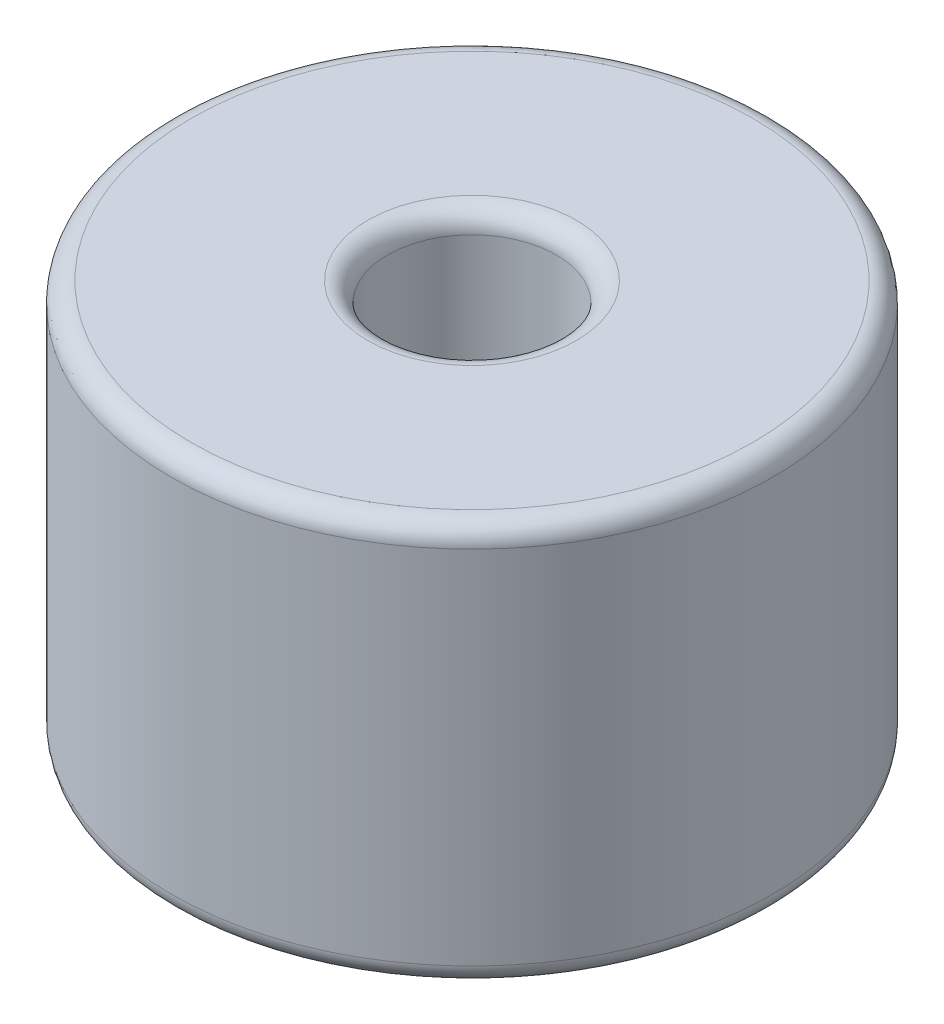
ISO-10303-21;
HEADER;
FILE_DESCRIPTION(('STEP AP214'),'2;1');
FILE_NAME('part.step','',(''),(''),'','','');
FILE_SCHEMA(('AUTOMOTIVE_DESIGN { 1 0 10303 214 1 1 1 1 }'));
ENDSEC;
DATA;
#1=APPLICATION_CONTEXT('core data for automotive mechanical design processes');
#2=APPLICATION_PROTOCOL_DEFINITION('international standard','automotive_design',2000,#1);
#3=PRODUCT_CONTEXT('',#1,'mechanical');
#4=PRODUCT('Part','Part','',(#3));
#5=PRODUCT_RELATED_PRODUCT_CATEGORY('part','',(#4));
#6=PRODUCT_DEFINITION_FORMATION('','',#4);
#7=PRODUCT_DEFINITION_CONTEXT('part definition',#1,'design');
#8=PRODUCT_DEFINITION('design','',#6,#7);
#9=PRODUCT_DEFINITION_SHAPE('','',#8);
#10=(LENGTH_UNIT() NAMED_UNIT(*) SI_UNIT(.MILLI.,.METRE.));
#11=(NAMED_UNIT(*) PLANE_ANGLE_UNIT() SI_UNIT($,.RADIAN.));
#12=(NAMED_UNIT(*) SI_UNIT($,.STERADIAN.) SOLID_ANGLE_UNIT());
#13=UNCERTAINTY_MEASURE_WITH_UNIT(LENGTH_MEASURE(1.E-05),#10,'distance_accuracy_value','');
#14=(GEOMETRIC_REPRESENTATION_CONTEXT(3) GLOBAL_UNCERTAINTY_ASSIGNED_CONTEXT((#13)) GLOBAL_UNIT_ASSIGNED_CONTEXT((#10,
#11,#12)) REPRESENTATION_CONTEXT('',''));
#15=CARTESIAN_POINT('',(0.,0.,0.));
#16=DIRECTION('',(0.,0.,1.));
#17=DIRECTION('',(1.,0.,0.));
#18=AXIS2_PLACEMENT_3D('',#15,#16,#17);
#19=CARTESIAN_POINT('',(0.,10.,0.));
#20=DIRECTION('',(0.,1.,0.));
#21=DIRECTION('',(0.,0.,1.));
#22=AXIS2_PLACEMENT_3D('',#19,#20,#21);
#23=PLANE('',#22);
#24=CARTESIAN_POINT('',(0.,10.,0.));
#25=DIRECTION('',(0.,1.,0.));
#26=DIRECTION('',(0.,0.,1.));
#27=AXIS2_PLACEMENT_3D('',#24,#25,#26);
#28=CIRCLE('',#27,7.);
#29=CARTESIAN_POINT('',(0.,10.,7.));
#30=VERTEX_POINT('',#29);
#31=EDGE_CURVE('E42',#30,#30,#28,.T.);
#32=ORIENTED_EDGE('',*,*,#31,.T.);
#33=EDGE_LOOP('',(#32));
#34=FACE_BOUND('',#33,.T.);
#35=CARTESIAN_POINT('',(0.,10.,0.));
#36=DIRECTION('',(0.,1.,0.));
#37=DIRECTION('',(0.,0.,1.));
#38=AXIS2_PLACEMENT_3D('',#35,#36,#37);
#39=CIRCLE('',#38,2.6);
#40=CARTESIAN_POINT('',(0.,10.,2.6));
#41=VERTEX_POINT('',#40);
#42=EDGE_CURVE('E46',#41,#41,#39,.F.);
#43=ORIENTED_EDGE('',*,*,#42,.T.);
#44=EDGE_LOOP('',(#43));
#45=FACE_BOUND('',#44,.T.);
#46=ADVANCED_FACE('F31',(#34,#45),#23,.T.);
#47=CARTESIAN_POINT('',(0.,0.,0.));
#48=DIRECTION('',(0.,1.,0.));
#49=DIRECTION('',(0.,0.,1.));
#50=AXIS2_PLACEMENT_3D('',#47,#48,#49);
#51=PLANE('',#50);
#52=CARTESIAN_POINT('',(0.,0.,0.));
#53=DIRECTION('',(0.,1.,0.));
#54=DIRECTION('',(0.,0.,1.));
#55=AXIS2_PLACEMENT_3D('',#52,#53,#54);
#56=CIRCLE('',#55,7.);
#57=CARTESIAN_POINT('',(0.,0.,7.));
#58=VERTEX_POINT('',#57);
#59=EDGE_CURVE('E51',#58,#58,#56,.F.);
#60=ORIENTED_EDGE('',*,*,#59,.T.);
#61=EDGE_LOOP('',(#60));
#62=FACE_BOUND('',#61,.T.);
#63=CARTESIAN_POINT('',(0.,0.,0.));
#64=DIRECTION('',(0.,1.,0.));
#65=DIRECTION('',(0.,0.,1.));
#66=AXIS2_PLACEMENT_3D('',#63,#64,#65);
#67=CIRCLE('',#66,2.6);
#68=CARTESIAN_POINT('',(0.,0.,2.6));
#69=VERTEX_POINT('',#68);
#70=EDGE_CURVE('E54',#69,#69,#67,.T.);
#71=ORIENTED_EDGE('',*,*,#70,.T.);
#72=EDGE_LOOP('',(#71));
#73=FACE_BOUND('',#72,.T.);
#74=ADVANCED_FACE('F76',(#62,#73),#51,.F.);
#75=CARTESIAN_POINT('',(0.,10.,0.));
#76=DIRECTION('',(0.,-1.,0.));
#77=DIRECTION('',(0.,0.,-1.));
#78=AXIS2_PLACEMENT_3D('',#75,#76,#77);
#79=CYLINDRICAL_SURFACE('',#78,7.5);
#80=CARTESIAN_POINT('',(0.,0.5,0.));
#81=DIRECTION('',(0.,1.,0.));
#82=DIRECTION('',(0.,0.,1.));
#83=AXIS2_PLACEMENT_3D('',#80,#81,#82);
#84=CIRCLE('',#83,7.5);
#85=CARTESIAN_POINT('',(0.,0.5,7.5));
#86=VERTEX_POINT('',#85);
#87=EDGE_CURVE('E57',#86,#86,#84,.T.);
#88=ORIENTED_EDGE('',*,*,#87,.T.);
#89=EDGE_LOOP('',(#88));
#90=FACE_BOUND('',#89,.T.);
#91=CARTESIAN_POINT('',(0.,9.5,0.));
#92=DIRECTION('',(0.,1.,0.));
#93=DIRECTION('',(0.,0.,1.));
#94=AXIS2_PLACEMENT_3D('',#91,#92,#93);
#95=CIRCLE('',#94,7.5);
#96=CARTESIAN_POINT('',(0.,9.5,7.5));
#97=VERTEX_POINT('',#96);
#98=EDGE_CURVE('E60',#97,#97,#95,.F.);
#99=ORIENTED_EDGE('',*,*,#98,.T.);
#100=EDGE_LOOP('',(#99));
#101=FACE_BOUND('',#100,.T.);
#102=ADVANCED_FACE('F64',(#90,#101),#79,.T.);
#103=CARTESIAN_POINT('',(0.,10.,0.));
#104=DIRECTION('',(0.,-1.,0.));
#105=DIRECTION('',(0.,0.,-1.));
#106=AXIS2_PLACEMENT_3D('',#103,#104,#105);
#107=CYLINDRICAL_SURFACE('',#106,2.1);
#108=CARTESIAN_POINT('',(0.,0.5,0.));
#109=DIRECTION('',(0.,1.,0.));
#110=DIRECTION('',(0.,0.,1.));
#111=AXIS2_PLACEMENT_3D('',#108,#109,#110);
#112=CIRCLE('',#111,2.1);
#113=CARTESIAN_POINT('',(0.,0.5,2.1));
#114=VERTEX_POINT('',#113);
#115=EDGE_CURVE('E10',#114,#114,#112,.F.);
#116=ORIENTED_EDGE('',*,*,#115,.T.);
#117=EDGE_LOOP('',(#116));
#118=FACE_BOUND('',#117,.T.);
#119=CARTESIAN_POINT('',(0.,9.5,0.));
#120=DIRECTION('',(0.,1.,0.));
#121=DIRECTION('',(0.,0.,1.));
#122=AXIS2_PLACEMENT_3D('',#119,#120,#121);
#123=CIRCLE('',#122,2.1);
#124=CARTESIAN_POINT('',(0.,9.5,2.1));
#125=VERTEX_POINT('',#124);
#126=EDGE_CURVE('E38',#125,#125,#123,.T.);
#127=ORIENTED_EDGE('',*,*,#126,.T.);
#128=EDGE_LOOP('',(#127));
#129=FACE_BOUND('',#128,.T.);
#130=ADVANCED_FACE('F92',(#118,#129),#107,.F.);
#131=CARTESIAN_POINT('',(0.,0.5,0.));
#132=DIRECTION('',(0.,1.,0.));
#133=DIRECTION('',(0.,0.,1.));
#134=AXIS2_PLACEMENT_3D('',#131,#132,#133);
#135=TOROIDAL_SURFACE('',#134,7.,0.5);
#136=ORIENTED_EDGE('',*,*,#59,.F.);
#137=EDGE_LOOP('',(#136));
#138=FACE_BOUND('',#137,.T.);
#139=ORIENTED_EDGE('',*,*,#87,.F.);
#140=EDGE_LOOP('',(#139));
#141=FACE_BOUND('',#140,.T.);
#142=ADVANCED_FACE('F70',(#138,#141),#135,.T.);
#143=CARTESIAN_POINT('',(0.,9.5,0.));
#144=DIRECTION('',(0.,1.,0.));
#145=DIRECTION('',(0.,0.,1.));
#146=AXIS2_PLACEMENT_3D('',#143,#144,#145);
#147=TOROIDAL_SURFACE('',#146,7.,0.5);
#148=ORIENTED_EDGE('',*,*,#98,.F.);
#149=EDGE_LOOP('',(#148));
#150=FACE_BOUND('',#149,.T.);
#151=ORIENTED_EDGE('',*,*,#31,.F.);
#152=EDGE_LOOP('',(#151));
#153=FACE_BOUND('',#152,.T.);
#154=ADVANCED_FACE('F66',(#150,#153),#147,.T.);
#155=CARTESIAN_POINT('',(0.,0.5,0.));
#156=DIRECTION('',(0.,1.,0.));
#157=DIRECTION('',(0.,0.,1.));
#158=AXIS2_PLACEMENT_3D('',#155,#156,#157);
#159=TOROIDAL_SURFACE('',#158,2.6,0.5);
#160=ORIENTED_EDGE('',*,*,#115,.F.);
#161=EDGE_LOOP('',(#160));
#162=FACE_BOUND('',#161,.T.);
#163=ORIENTED_EDGE('',*,*,#70,.F.);
#164=EDGE_LOOP('',(#163));
#165=FACE_BOUND('',#164,.T.);
#166=ADVANCED_FACE('F69',(#162,#165),#159,.T.);
#167=CARTESIAN_POINT('',(0.,9.5,0.));
#168=DIRECTION('',(0.,1.,0.));
#169=DIRECTION('',(0.,0.,1.));
#170=AXIS2_PLACEMENT_3D('',#167,#168,#169);
#171=TOROIDAL_SURFACE('',#170,2.6,0.5);
#172=ORIENTED_EDGE('',*,*,#42,.F.);
#173=EDGE_LOOP('',(#172));
#174=FACE_BOUND('',#173,.T.);
#175=ORIENTED_EDGE('',*,*,#126,.F.);
#176=EDGE_LOOP('',(#175));
#177=FACE_BOUND('',#176,.T.);
#178=ADVANCED_FACE('F33',(#174,#177),#171,.T.);
#179=CLOSED_SHELL('',(#46,#74,#102,#130,#142,#154,#166,#178));
#180=MANIFOLD_SOLID_BREP('B2',#179);
#181=ADVANCED_BREP_SHAPE_REPRESENTATION('',(#18,#180),#14);
#182=SHAPE_DEFINITION_REPRESENTATION(#9,#181);
ENDSEC;
END-ISO-10303-21;
